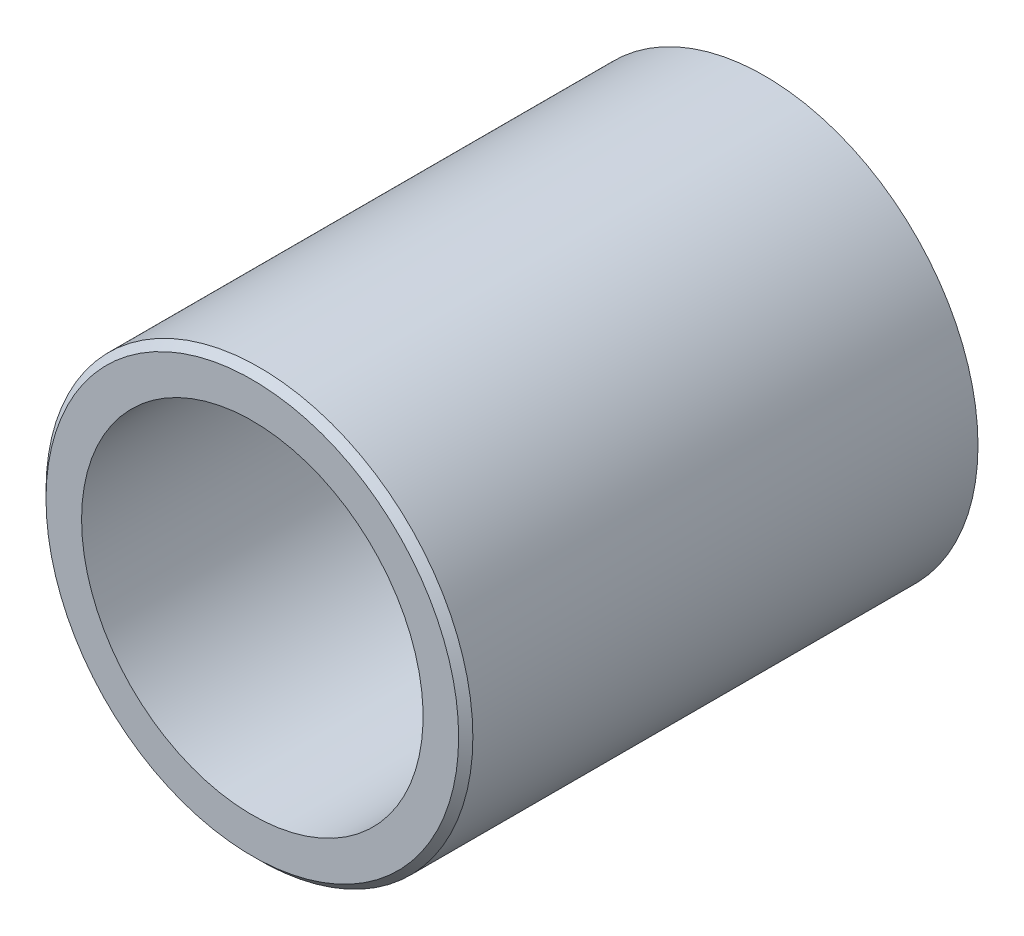
ISO-10303-21;
HEADER;
FILE_DESCRIPTION(('STEP AP214'),'2;1');
FILE_NAME('part.step','',(''),(''),'','','');
FILE_SCHEMA(('AUTOMOTIVE_DESIGN { 1 0 10303 214 1 1 1 1 }'));
ENDSEC;
DATA;
#1=APPLICATION_CONTEXT('core data for automotive mechanical design processes');
#2=APPLICATION_PROTOCOL_DEFINITION('international standard','automotive_design',2000,#1);
#3=PRODUCT_CONTEXT('',#1,'mechanical');
#4=PRODUCT('Part','Part','',(#3));
#5=PRODUCT_RELATED_PRODUCT_CATEGORY('part','',(#4));
#6=PRODUCT_DEFINITION_FORMATION('','',#4);
#7=PRODUCT_DEFINITION_CONTEXT('part definition',#1,'design');
#8=PRODUCT_DEFINITION('design','',#6,#7);
#9=PRODUCT_DEFINITION_SHAPE('','',#8);
#10=(LENGTH_UNIT() NAMED_UNIT(*) SI_UNIT(.MILLI.,.METRE.));
#11=(NAMED_UNIT(*) PLANE_ANGLE_UNIT() SI_UNIT($,.RADIAN.));
#12=(NAMED_UNIT(*) SI_UNIT($,.STERADIAN.) SOLID_ANGLE_UNIT());
#13=UNCERTAINTY_MEASURE_WITH_UNIT(LENGTH_MEASURE(1.E-05),#10,'distance_accuracy_value','');
#14=(GEOMETRIC_REPRESENTATION_CONTEXT(3) GLOBAL_UNCERTAINTY_ASSIGNED_CONTEXT((#13)) GLOBAL_UNIT_ASSIGNED_CONTEXT((#10,
#11,#12)) REPRESENTATION_CONTEXT('',''));
#15=CARTESIAN_POINT('',(0.,0.,0.));
#16=DIRECTION('',(0.,0.,1.));
#17=DIRECTION('',(1.,0.,0.));
#18=AXIS2_PLACEMENT_3D('',#15,#16,#17);
#19=CARTESIAN_POINT('',(0.,0.,9.525));
#20=DIRECTION('',(0.,0.,1.));
#21=DIRECTION('',(1.,0.,0.));
#22=AXIS2_PLACEMENT_3D('',#19,#20,#21);
#23=PLANE('',#22);
#24=CARTESIAN_POINT('',(0.,0.,9.525));
#25=DIRECTION('',(0.,0.,1.));
#26=DIRECTION('',(1.,0.,0.));
#27=AXIS2_PLACEMENT_3D('',#24,#25,#26);
#28=CIRCLE('',#27,7.67291666666668);
#29=CARTESIAN_POINT('',(7.67291666666668,0.,9.525));
#30=VERTEX_POINT('',#29);
#31=EDGE_CURVE('E41',#30,#30,#28,.T.);
#32=ORIENTED_EDGE('',*,*,#31,.T.);
#33=EDGE_LOOP('',(#32));
#34=FACE_BOUND('',#33,.T.);
#35=CARTESIAN_POINT('',(0.,0.,9.525));
#36=DIRECTION('',(0.,0.,1.));
#37=DIRECTION('',(1.,0.,0.));
#38=AXIS2_PLACEMENT_3D('',#35,#36,#37);
#39=CIRCLE('',#38,6.35);
#40=CARTESIAN_POINT('',(-6.35,0.,9.525));
#41=VERTEX_POINT('',#40);
#42=EDGE_CURVE('E49',#41,#41,#39,.T.);
#43=ORIENTED_EDGE('',*,*,#42,.F.);
#44=EDGE_LOOP('',(#43));
#45=FACE_BOUND('',#44,.T.);
#46=ADVANCED_FACE('F34',(#34,#45),#23,.T.);
#47=CARTESIAN_POINT('',(0.,0.,-9.525));
#48=DIRECTION('',(0.,0.,1.));
#49=DIRECTION('',(1.,0.,0.));
#50=AXIS2_PLACEMENT_3D('',#47,#48,#49);
#51=PLANE('',#50);
#52=CARTESIAN_POINT('',(0.,0.,-9.525));
#53=DIRECTION('',(0.,0.,1.));
#54=DIRECTION('',(1.,0.,0.));
#55=AXIS2_PLACEMENT_3D('',#52,#53,#54);
#56=CIRCLE('',#55,7.9375);
#57=CARTESIAN_POINT('',(-7.9375,0.,-9.525));
#58=VERTEX_POINT('',#57);
#59=EDGE_CURVE('E45',#58,#58,#56,.T.);
#60=ORIENTED_EDGE('',*,*,#59,.F.);
#61=EDGE_LOOP('',(#60));
#62=FACE_BOUND('',#61,.T.);
#63=CARTESIAN_POINT('',(0.,0.,-9.525));
#64=DIRECTION('',(0.,0.,1.));
#65=DIRECTION('',(1.,0.,0.));
#66=AXIS2_PLACEMENT_3D('',#63,#64,#65);
#67=CIRCLE('',#66,6.35);
#68=CARTESIAN_POINT('',(-6.35,0.,-9.525));
#69=VERTEX_POINT('',#68);
#70=EDGE_CURVE('E52',#69,#69,#67,.T.);
#71=ORIENTED_EDGE('',*,*,#70,.T.);
#72=EDGE_LOOP('',(#71));
#73=FACE_BOUND('',#72,.T.);
#74=ADVANCED_FACE('F62',(#62,#73),#51,.F.);
#75=CARTESIAN_POINT('',(0.,0.,9.525));
#76=DIRECTION('',(0.,0.,-1.));
#77=DIRECTION('',(-1.,0.,0.));
#78=AXIS2_PLACEMENT_3D('',#75,#76,#77);
#79=CYLINDRICAL_SURFACE('',#78,7.9375);
#80=CARTESIAN_POINT('',(0.,0.,9.26041666666668));
#81=DIRECTION('',(0.,0.,1.));
#82=DIRECTION('',(1.,0.,0.));
#83=AXIS2_PLACEMENT_3D('',#80,#81,#82);
#84=CIRCLE('',#83,7.9375);
#85=CARTESIAN_POINT('',(-7.9375,0.,9.26041666666668));
#86=VERTEX_POINT('',#85);
#87=EDGE_CURVE('E10',#86,#86,#84,.F.);
#88=CARTESIAN_POINT('',(-7.9375,0.,9.26041666666668));
#89=CARTESIAN_POINT('',(-7.9375,0.,9.06473524305557));
#90=CARTESIAN_POINT('',(-7.9375,0.,8.86905381944446));
#91=CARTESIAN_POINT('',(-7.9375,0.,8.47769097222224));
#92=CARTESIAN_POINT('',(-7.9375,0.,8.28200954861113));
#93=CARTESIAN_POINT('',(-7.9375,0.,7.8906467013889));
#94=CARTESIAN_POINT('',(-7.9375,0.,7.69496527777779));
#95=CARTESIAN_POINT('',(-7.9375,0.,7.30360243055557));
#96=CARTESIAN_POINT('',(-7.9375,0.,7.10792100694446));
#97=CARTESIAN_POINT('',(-7.9375,0.,6.71655815972224));
#98=CARTESIAN_POINT('',(-7.9375,0.,6.52087673611113));
#99=CARTESIAN_POINT('',(-7.9375,0.,6.1295138888889));
#100=CARTESIAN_POINT('',(-7.9375,0.,5.93383246527779));
#101=CARTESIAN_POINT('',(-7.9375,0.,5.54246961805557));
#102=CARTESIAN_POINT('',(-7.9375,0.,5.34678819444446));
#103=CARTESIAN_POINT('',(-7.9375,0.,4.95542534722224));
#104=CARTESIAN_POINT('',(-7.9375,0.,4.75974392361112));
#105=CARTESIAN_POINT('',(-7.9375,0.,4.3683810763889));
#106=CARTESIAN_POINT('',(-7.9375,0.,4.17269965277779));
#107=CARTESIAN_POINT('',(-7.9375,0.,3.78133680555557));
#108=CARTESIAN_POINT('',(-7.9375,0.,3.58565538194446));
#109=CARTESIAN_POINT('',(-7.9375,0.,3.19429253472223));
#110=CARTESIAN_POINT('',(-7.9375,0.,2.99861111111112));
#111=CARTESIAN_POINT('',(-7.9375,0.,2.6072482638889));
#112=CARTESIAN_POINT('',(-7.9375,0.,2.41156684027779));
#113=CARTESIAN_POINT('',(-7.9375,0.,2.02020399305557));
#114=CARTESIAN_POINT('',(-7.9375,0.,1.82452256944445));
#115=CARTESIAN_POINT('',(-7.9375,0.,1.43315972222223));
#116=CARTESIAN_POINT('',(-7.9375,0.,1.23747829861112));
#117=CARTESIAN_POINT('',(-7.9375,0.,0.846115451388898));
#118=CARTESIAN_POINT('',(-7.9375,0.,0.650434027777786));
#119=CARTESIAN_POINT('',(-7.9375,0.,0.259071180555563));
#120=CARTESIAN_POINT('',(-7.9375,0.,0.0633897569444521));
#121=CARTESIAN_POINT('',(-7.9375,0.,-0.32797309027777));
#122=CARTESIAN_POINT('',(-7.9375,0.,-0.523654513888881));
#123=CARTESIAN_POINT('',(-7.9375,0.,-0.915017361111104));
#124=CARTESIAN_POINT('',(-7.9375,0.,-1.11069878472222));
#125=CARTESIAN_POINT('',(-7.9375,0.,-1.50206163194444));
#126=CARTESIAN_POINT('',(-7.9375,0.,-1.69774305555555));
#127=CARTESIAN_POINT('',(-7.9375,0.,-2.08910590277777));
#128=CARTESIAN_POINT('',(-7.9375,0.,-2.28478732638888));
#129=CARTESIAN_POINT('',(-7.9375,0.,-2.67615017361111));
#130=CARTESIAN_POINT('',(-7.9375,0.,-2.87183159722222));
#131=CARTESIAN_POINT('',(-7.9375,0.,-3.26319444444444));
#132=CARTESIAN_POINT('',(-7.9375,0.,-3.45887586805555));
#133=CARTESIAN_POINT('',(-7.9375,0.,-3.85023871527777));
#134=CARTESIAN_POINT('',(-7.9375,0.,-4.04592013888889));
#135=CARTESIAN_POINT('',(-7.9375,0.,-4.43728298611111));
#136=CARTESIAN_POINT('',(-7.9375,0.,-4.63296440972222));
#137=CARTESIAN_POINT('',(-7.9375,0.,-5.02432725694444));
#138=CARTESIAN_POINT('',(-7.9375,0.,-5.22000868055555));
#139=CARTESIAN_POINT('',(-7.9375,0.,-5.61137152777778));
#140=CARTESIAN_POINT('',(-7.9375,0.,-5.80705295138889));
#141=CARTESIAN_POINT('',(-7.9375,0.,-6.19841579861111));
#142=CARTESIAN_POINT('',(-7.9375,0.,-6.39409722222222));
#143=CARTESIAN_POINT('',(-7.9375,0.,-6.78546006944444));
#144=CARTESIAN_POINT('',(-7.9375,0.,-6.98114149305555));
#145=CARTESIAN_POINT('',(-7.9375,0.,-7.37250434027778));
#146=CARTESIAN_POINT('',(-7.9375,0.,-7.56818576388889));
#147=CARTESIAN_POINT('',(-7.9375,0.,-7.95954861111111));
#148=CARTESIAN_POINT('',(-7.9375,0.,-8.15523003472222));
#149=CARTESIAN_POINT('',(-7.9375,0.,-8.54659288194444));
#150=CARTESIAN_POINT('',(-7.9375,0.,-8.74227430555556));
#151=CARTESIAN_POINT('',(-7.9375,0.,-9.13363715277778));
#152=CARTESIAN_POINT('',(-7.9375,0.,-9.32931857638889));
#153=CARTESIAN_POINT('',(-7.9375,0.,-9.525));
#154=B_SPLINE_CURVE_WITH_KNOTS('',3,(#88,#89,#90,#91,#92,#93,#94,#95,#96,#97,#98,#99,#100,#101,
#102,#103,#104,#105,#106,#107,#108,#109,#110,#111,#112,#113,#114,#115,#116,#117,#118,#119,#120,
#121,#122,#123,#124,#125,#126,#127,#128,#129,#130,#131,#132,#133,#134,#135,#136,#137,#138,#139,
#140,#141,#142,#143,#144,#145,#146,#147,#148,#149,#150,#151,#152,#153),.UNSPECIFIED.,.F.,.F.,(4,
2,2,2,2,2,2,2,2,2,2,2,2,2,2,2,2,2,2,2,2,2,2,2,2,2,2,2,2,2,2,2,4),(0.,0.587044270833333,
1.17408854166667,1.7611328125,2.34817708333334,2.93522135416667,3.522265625,4.10930989583334,
4.69635416666667,5.2833984375,5.87044270833334,6.45748697916667,7.04453125000001,
7.63157552083334,8.21861979166667,8.80566406250001,9.39270833333334,9.97975260416668,
10.566796875,11.1538411458333,11.7408854166667,12.3279296875,12.9149739583333,13.5020182291667,
14.0890625,14.6761067708333,15.2631510416667,15.8501953125,16.4372395833333,17.0242838541667,
17.611328125,18.1983723958333,18.7854166666667),.UNSPECIFIED.);
#155=EDGE_CURVE('BSEAM67',#86,#58,#154,.T.);
#156=ORIENTED_EDGE('',*,*,#87,.T.);
#157=ORIENTED_EDGE('',*,*,#59,.T.);
#158=ORIENTED_EDGE('',*,*,#155,.T.);
#159=ORIENTED_EDGE('',*,*,#155,.F.);
#160=EDGE_LOOP('',(#156,#158,#157,#159));
#161=FACE_BOUND('',#160,.T.);
#162=ADVANCED_FACE('F67',(#161),#79,.T.);
#163=CARTESIAN_POINT('',(0.,0.,9.525));
#164=DIRECTION('',(0.,0.,-1.));
#165=DIRECTION('',(-1.,0.,0.));
#166=AXIS2_PLACEMENT_3D('',#163,#164,#165);
#167=CYLINDRICAL_SURFACE('',#166,6.35);
#168=CARTESIAN_POINT('',(-6.35,0.,9.525));
#169=CARTESIAN_POINT('',(-6.35,0.,9.3265625));
#170=CARTESIAN_POINT('',(-6.35,0.,9.128125));
#171=CARTESIAN_POINT('',(-6.35,0.,8.73125));
#172=CARTESIAN_POINT('',(-6.35,0.,8.5328125));
#173=CARTESIAN_POINT('',(-6.35,0.,8.1359375));
#174=CARTESIAN_POINT('',(-6.35,0.,7.9375));
#175=CARTESIAN_POINT('',(-6.35,0.,7.540625));
#176=CARTESIAN_POINT('',(-6.35,0.,7.3421875));
#177=CARTESIAN_POINT('',(-6.35,0.,6.9453125));
#178=CARTESIAN_POINT('',(-6.35,0.,6.746875));
#179=CARTESIAN_POINT('',(-6.35,0.,6.35));
#180=CARTESIAN_POINT('',(-6.35,0.,6.1515625));
#181=CARTESIAN_POINT('',(-6.35,0.,5.7546875));
#182=CARTESIAN_POINT('',(-6.35,0.,5.55625));
#183=CARTESIAN_POINT('',(-6.35,0.,5.159375));
#184=CARTESIAN_POINT('',(-6.35,0.,4.9609375));
#185=CARTESIAN_POINT('',(-6.35,0.,4.5640625));
#186=CARTESIAN_POINT('',(-6.35,0.,4.365625));
#187=CARTESIAN_POINT('',(-6.35,0.,3.96875));
#188=CARTESIAN_POINT('',(-6.35,0.,3.7703125));
#189=CARTESIAN_POINT('',(-6.35,0.,3.3734375));
#190=CARTESIAN_POINT('',(-6.35,0.,3.175));
#191=CARTESIAN_POINT('',(-6.35,0.,2.778125));
#192=CARTESIAN_POINT('',(-6.35,0.,2.5796875));
#193=CARTESIAN_POINT('',(-6.35,0.,2.1828125));
#194=CARTESIAN_POINT('',(-6.35,0.,1.984375));
#195=CARTESIAN_POINT('',(-6.35,0.,1.5875));
#196=CARTESIAN_POINT('',(-6.35,0.,1.3890625));
#197=CARTESIAN_POINT('',(-6.35,0.,0.992187500000001));
#198=CARTESIAN_POINT('',(-6.35,0.,0.793750000000001));
#199=CARTESIAN_POINT('',(-6.35,0.,0.396875));
#200=CARTESIAN_POINT('',(-6.35,0.,0.1984375));
#201=CARTESIAN_POINT('',(-6.35,0.,-0.1984375));
#202=CARTESIAN_POINT('',(-6.35,0.,-0.396875));
#203=CARTESIAN_POINT('',(-6.35,0.,-0.793750000000001));
#204=CARTESIAN_POINT('',(-6.35,0.,-0.992187500000001));
#205=CARTESIAN_POINT('',(-6.35,0.,-1.3890625));
#206=CARTESIAN_POINT('',(-6.35,0.,-1.5875));
#207=CARTESIAN_POINT('',(-6.35,0.,-1.984375));
#208=CARTESIAN_POINT('',(-6.35,0.,-2.1828125));
#209=CARTESIAN_POINT('',(-6.35,0.,-2.5796875));
#210=CARTESIAN_POINT('',(-6.35,0.,-2.778125));
#211=CARTESIAN_POINT('',(-6.35,0.,-3.175));
#212=CARTESIAN_POINT('',(-6.35,0.,-3.3734375));
#213=CARTESIAN_POINT('',(-6.35,0.,-3.7703125));
#214=CARTESIAN_POINT('',(-6.35,0.,-3.96875));
#215=CARTESIAN_POINT('',(-6.35,0.,-4.365625));
#216=CARTESIAN_POINT('',(-6.35,0.,-4.5640625));
#217=CARTESIAN_POINT('',(-6.35,0.,-4.9609375));
#218=CARTESIAN_POINT('',(-6.35,0.,-5.159375));
#219=CARTESIAN_POINT('',(-6.35,0.,-5.55625));
#220=CARTESIAN_POINT('',(-6.35,0.,-5.7546875));
#221=CARTESIAN_POINT('',(-6.35,0.,-6.1515625));
#222=CARTESIAN_POINT('',(-6.35,0.,-6.35));
#223=CARTESIAN_POINT('',(-6.35,0.,-6.746875));
#224=CARTESIAN_POINT('',(-6.35,0.,-6.9453125));
#225=CARTESIAN_POINT('',(-6.35,0.,-7.3421875));
#226=CARTESIAN_POINT('',(-6.35,0.,-7.540625));
#227=CARTESIAN_POINT('',(-6.35,0.,-7.9375));
#228=CARTESIAN_POINT('',(-6.35,0.,-8.1359375));
#229=CARTESIAN_POINT('',(-6.35,0.,-8.5328125));
#230=CARTESIAN_POINT('',(-6.35,0.,-8.73125));
#231=CARTESIAN_POINT('',(-6.35,0.,-9.128125));
#232=CARTESIAN_POINT('',(-6.35,0.,-9.3265625));
#233=CARTESIAN_POINT('',(-6.35,0.,-9.525));
#234=B_SPLINE_CURVE_WITH_KNOTS('',3,(#168,#169,#170,#171,#172,#173,#174,#175,#176,#177,#178,
#179,#180,#181,#182,#183,#184,#185,#186,#187,#188,#189,#190,#191,#192,#193,#194,#195,#196,#197,
#198,#199,#200,#201,#202,#203,#204,#205,#206,#207,#208,#209,#210,#211,#212,#213,#214,#215,#216,
#217,#218,#219,#220,#221,#222,#223,#224,#225,#226,#227,#228,#229,#230,#231,#232,#233),
.UNSPECIFIED.,.F.,.F.,(4,2,2,2,2,2,2,2,2,2,2,2,2,2,2,2,2,2,2,2,2,2,2,2,2,2,2,2,2,2,2,2,4),(0.,
0.5953125,1.190625,1.7859375,2.38125,2.9765625,3.571875,4.1671875,4.7625,5.3578125,5.953125,
6.5484375,7.14375,7.7390625,8.334375,8.9296875,9.525,10.1203125,10.715625,11.3109375,11.90625,
12.5015625,13.096875,13.6921875,14.2875,14.8828125,15.478125,16.0734375,16.66875,17.2640625,
17.859375,18.4546875,19.05),.UNSPECIFIED.);
#235=EDGE_CURVE('BSEAM58',#41,#69,#234,.T.);
#236=ORIENTED_EDGE('',*,*,#42,.T.);
#237=ORIENTED_EDGE('',*,*,#70,.F.);
#238=ORIENTED_EDGE('',*,*,#235,.T.);
#239=ORIENTED_EDGE('',*,*,#235,.F.);
#240=EDGE_LOOP('',(#236,#238,#237,#239));
#241=FACE_BOUND('',#240,.T.);
#242=ADVANCED_FACE('F58',(#241),#167,.F.);
#243=CARTESIAN_POINT('',(0.,0.,9.525));
#244=DIRECTION('',(0.,0.,-1.));
#245=DIRECTION('',(-1.,0.,0.));
#246=AXIS2_PLACEMENT_3D('',#243,#244,#245);
#247=CONICAL_SURFACE('',#246,7.67291666666668,0.785398163397448);
#248=ORIENTED_EDGE('',*,*,#87,.F.);
#249=EDGE_LOOP('',(#248));
#250=FACE_BOUND('',#249,.T.);
#251=ORIENTED_EDGE('',*,*,#31,.F.);
#252=EDGE_LOOP('',(#251));
#253=FACE_BOUND('',#252,.T.);
#254=ADVANCED_FACE('F36',(#250,#253),#247,.T.);
#255=CLOSED_SHELL('',(#46,#74,#162,#242,#254));
#256=MANIFOLD_SOLID_BREP('B2',#255);
#257=ADVANCED_BREP_SHAPE_REPRESENTATION('',(#18,#256),#14);
#258=SHAPE_DEFINITION_REPRESENTATION(#9,#257);
ENDSEC;
END-ISO-10303-21;
